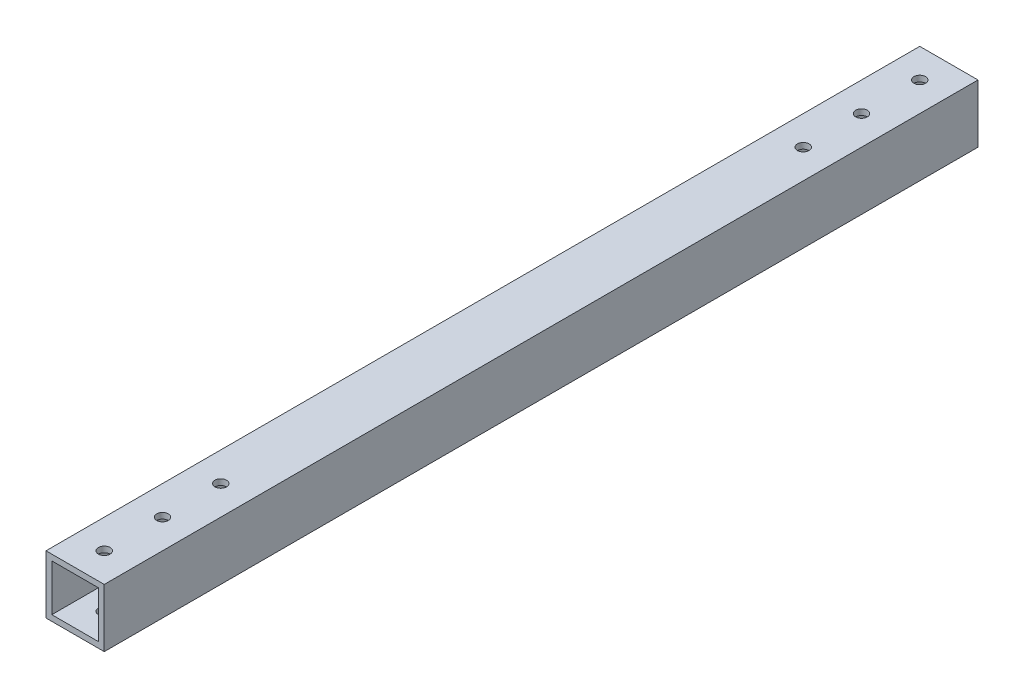
ISO-10303-21;
HEADER;
FILE_DESCRIPTION(('STEP AP214'),'2;1');
FILE_NAME('part.step','',(''),(''),'','','');
FILE_SCHEMA(('AUTOMOTIVE_DESIGN { 1 0 10303 214 1 1 1 1 }'));
ENDSEC;
DATA;
#1=APPLICATION_CONTEXT('core data for automotive mechanical design processes');
#2=APPLICATION_PROTOCOL_DEFINITION('international standard','automotive_design',2000,#1);
#3=PRODUCT_CONTEXT('',#1,'mechanical');
#4=PRODUCT('Part','Part','',(#3));
#5=PRODUCT_RELATED_PRODUCT_CATEGORY('part','',(#4));
#6=PRODUCT_DEFINITION_FORMATION('','',#4);
#7=PRODUCT_DEFINITION_CONTEXT('part definition',#1,'design');
#8=PRODUCT_DEFINITION('design','',#6,#7);
#9=PRODUCT_DEFINITION_SHAPE('','',#8);
#10=(LENGTH_UNIT() NAMED_UNIT(*) SI_UNIT(.MILLI.,.METRE.));
#11=(NAMED_UNIT(*) PLANE_ANGLE_UNIT() SI_UNIT($,.RADIAN.));
#12=(NAMED_UNIT(*) SI_UNIT($,.STERADIAN.) SOLID_ANGLE_UNIT());
#13=UNCERTAINTY_MEASURE_WITH_UNIT(LENGTH_MEASURE(1.E-05),#10,'distance_accuracy_value','');
#14=(GEOMETRIC_REPRESENTATION_CONTEXT(3) GLOBAL_UNCERTAINTY_ASSIGNED_CONTEXT((#13)) GLOBAL_UNIT_ASSIGNED_CONTEXT((#10,
#11,#12)) REPRESENTATION_CONTEXT('',''));
#15=CARTESIAN_POINT('',(0.,0.,0.));
#16=DIRECTION('',(0.,0.,1.));
#17=DIRECTION('',(1.,0.,0.));
#18=AXIS2_PLACEMENT_3D('',#15,#16,#17);
#19=CARTESIAN_POINT('',(0.,0.,300.));
#20=DIRECTION('',(0.,0.,1.));
#21=DIRECTION('',(1.,0.,0.));
#22=AXIS2_PLACEMENT_3D('',#19,#20,#21);
#23=PLANE('',#22);
#24=DIRECTION('',(0.,-1.,0.));
#25=VECTOR('',#24,1.);
#26=CARTESIAN_POINT('',(0.,0.,300.));
#27=LINE('',#26,#25);
#28=CARTESIAN_POINT('',(0.,20.,300.));
#29=VERTEX_POINT('',#28);
#30=CARTESIAN_POINT('',(0.,0.,300.));
#31=VERTEX_POINT('',#30);
#32=EDGE_CURVE('E175',#29,#31,#27,.T.);
#33=ORIENTED_EDGE('',*,*,#32,.T.);
#34=DIRECTION('',(1.,0.,0.));
#35=VECTOR('',#34,1.);
#36=CARTESIAN_POINT('',(0.,0.,300.));
#37=LINE('',#36,#35);
#38=CARTESIAN_POINT('',(20.,0.,300.));
#39=VERTEX_POINT('',#38);
#40=EDGE_CURVE('E178',#31,#39,#37,.T.);
#41=ORIENTED_EDGE('',*,*,#40,.T.);
#42=DIRECTION('',(0.,1.,0.));
#43=VECTOR('',#42,1.);
#44=CARTESIAN_POINT('',(20.,0.,300.));
#45=LINE('',#44,#43);
#46=CARTESIAN_POINT('',(20.,20.,300.));
#47=VERTEX_POINT('',#46);
#48=EDGE_CURVE('E181',#39,#47,#45,.T.);
#49=ORIENTED_EDGE('',*,*,#48,.T.);
#50=DIRECTION('',(-1.,0.,0.));
#51=VECTOR('',#50,1.);
#52=CARTESIAN_POINT('',(0.,20.,300.));
#53=LINE('',#52,#51);
#54=EDGE_CURVE('E183',#47,#29,#53,.T.);
#55=ORIENTED_EDGE('',*,*,#54,.T.);
#56=EDGE_LOOP('',(#33,#41,#49,#55));
#57=FACE_BOUND('',#56,.T.);
#58=DIRECTION('',(1.,0.,0.));
#59=VECTOR('',#58,1.);
#60=CARTESIAN_POINT('',(0.,2.,300.));
#61=LINE('',#60,#59);
#62=CARTESIAN_POINT('',(2.,2.,300.));
#63=VERTEX_POINT('',#62);
#64=CARTESIAN_POINT('',(18.,2.,300.));
#65=VERTEX_POINT('',#64);
#66=EDGE_CURVE('E145',#63,#65,#61,.T.);
#67=ORIENTED_EDGE('',*,*,#66,.F.);
#68=DIRECTION('',(0.,-1.,0.));
#69=VECTOR('',#68,1.);
#70=CARTESIAN_POINT('',(2.,0.,300.));
#71=LINE('',#70,#69);
#72=CARTESIAN_POINT('',(2.,18.,300.));
#73=VERTEX_POINT('',#72);
#74=EDGE_CURVE('E137',#73,#63,#71,.T.);
#75=ORIENTED_EDGE('',*,*,#74,.F.);
#76=DIRECTION('',(-1.,0.,0.));
#77=VECTOR('',#76,1.);
#78=CARTESIAN_POINT('',(0.,18.,300.));
#79=LINE('',#78,#77);
#80=CARTESIAN_POINT('',(18.,18.,300.));
#81=VERTEX_POINT('',#80);
#82=EDGE_CURVE('E159',#81,#73,#79,.T.);
#83=ORIENTED_EDGE('',*,*,#82,.F.);
#84=DIRECTION('',(0.,1.,0.));
#85=VECTOR('',#84,1.);
#86=CARTESIAN_POINT('',(18.,0.,300.));
#87=LINE('',#86,#85);
#88=EDGE_CURVE('E157',#65,#81,#87,.T.);
#89=ORIENTED_EDGE('',*,*,#88,.F.);
#90=EDGE_LOOP('',(#67,#75,#83,#89));
#91=FACE_BOUND('',#90,.T.);
#92=ADVANCED_FACE('F70',(#57,#91),#23,.T.);
#93=CARTESIAN_POINT('',(0.,0.,0.));
#94=DIRECTION('',(0.,0.,1.));
#95=DIRECTION('',(1.,0.,0.));
#96=AXIS2_PLACEMENT_3D('',#93,#94,#95);
#97=PLANE('',#96);
#98=DIRECTION('',(0.,-1.,0.));
#99=VECTOR('',#98,1.);
#100=CARTESIAN_POINT('',(0.,0.,0.));
#101=LINE('',#100,#99);
#102=CARTESIAN_POINT('',(0.,20.,0.));
#103=VERTEX_POINT('',#102);
#104=CARTESIAN_POINT('',(0.,0.,0.));
#105=VERTEX_POINT('',#104);
#106=EDGE_CURVE('E153',#103,#105,#101,.T.);
#107=ORIENTED_EDGE('',*,*,#106,.F.);
#108=DIRECTION('',(-1.,0.,0.));
#109=VECTOR('',#108,1.);
#110=CARTESIAN_POINT('',(0.,20.,0.));
#111=LINE('',#110,#109);
#112=CARTESIAN_POINT('',(20.,20.,0.));
#113=VERTEX_POINT('',#112);
#114=EDGE_CURVE('E179',#113,#103,#111,.T.);
#115=ORIENTED_EDGE('',*,*,#114,.F.);
#116=DIRECTION('',(0.,1.,0.));
#117=VECTOR('',#116,1.);
#118=CARTESIAN_POINT('',(20.,0.,0.));
#119=LINE('',#118,#117);
#120=CARTESIAN_POINT('',(20.,0.,0.));
#121=VERTEX_POINT('',#120);
#122=EDGE_CURVE('E190',#121,#113,#119,.T.);
#123=ORIENTED_EDGE('',*,*,#122,.F.);
#124=DIRECTION('',(1.,0.,0.));
#125=VECTOR('',#124,1.);
#126=CARTESIAN_POINT('',(0.,0.,0.));
#127=LINE('',#126,#125);
#128=EDGE_CURVE('E188',#105,#121,#127,.T.);
#129=ORIENTED_EDGE('',*,*,#128,.F.);
#130=EDGE_LOOP('',(#107,#115,#123,#129));
#131=FACE_BOUND('',#130,.T.);
#132=DIRECTION('',(0.,-1.,0.));
#133=VECTOR('',#132,1.);
#134=CARTESIAN_POINT('',(2.,0.,0.));
#135=LINE('',#134,#133);
#136=CARTESIAN_POINT('',(2.,18.,0.));
#137=VERTEX_POINT('',#136);
#138=CARTESIAN_POINT('',(2.,2.,0.));
#139=VERTEX_POINT('',#138);
#140=EDGE_CURVE('E95',#137,#139,#135,.T.);
#141=ORIENTED_EDGE('',*,*,#140,.T.);
#142=DIRECTION('',(1.,0.,0.));
#143=VECTOR('',#142,1.);
#144=CARTESIAN_POINT('',(0.,2.,0.));
#145=LINE('',#144,#143);
#146=CARTESIAN_POINT('',(18.,2.,0.));
#147=VERTEX_POINT('',#146);
#148=EDGE_CURVE('E152',#139,#147,#145,.T.);
#149=ORIENTED_EDGE('',*,*,#148,.T.);
#150=DIRECTION('',(0.,1.,0.));
#151=VECTOR('',#150,1.);
#152=CARTESIAN_POINT('',(18.,0.,0.));
#153=LINE('',#152,#151);
#154=CARTESIAN_POINT('',(18.,18.,0.));
#155=VERTEX_POINT('',#154);
#156=EDGE_CURVE('E167',#147,#155,#153,.T.);
#157=ORIENTED_EDGE('',*,*,#156,.T.);
#158=DIRECTION('',(-1.,0.,0.));
#159=VECTOR('',#158,1.);
#160=CARTESIAN_POINT('',(0.,18.,0.));
#161=LINE('',#160,#159);
#162=EDGE_CURVE('E146',#155,#137,#161,.T.);
#163=ORIENTED_EDGE('',*,*,#162,.T.);
#164=EDGE_LOOP('',(#141,#149,#157,#163));
#165=FACE_BOUND('',#164,.T.);
#166=ADVANCED_FACE('F254',(#131,#165),#97,.F.);
#167=CARTESIAN_POINT('',(0.,0.,300.));
#168=DIRECTION('',(1.,0.,0.));
#169=DIRECTION('',(0.,0.,-1.));
#170=AXIS2_PLACEMENT_3D('',#167,#168,#169);
#171=PLANE('',#170);
#172=ORIENTED_EDGE('',*,*,#106,.T.);
#173=DIRECTION('',(0.,0.,-1.));
#174=VECTOR('',#173,1.);
#175=CARTESIAN_POINT('',(0.,0.,300.));
#176=LINE('',#175,#174);
#177=EDGE_CURVE('E12',#31,#105,#176,.T.);
#178=ORIENTED_EDGE('',*,*,#177,.F.);
#179=ORIENTED_EDGE('',*,*,#32,.F.);
#180=DIRECTION('',(0.,0.,-1.));
#181=VECTOR('',#180,1.);
#182=CARTESIAN_POINT('',(0.,20.,300.));
#183=LINE('',#182,#181);
#184=EDGE_CURVE('E185',#29,#103,#183,.T.);
#185=ORIENTED_EDGE('',*,*,#184,.T.);
#186=EDGE_LOOP('',(#172,#178,#179,#185));
#187=FACE_BOUND('',#186,.T.);
#188=ADVANCED_FACE('F72',(#187),#171,.F.);
#189=CARTESIAN_POINT('',(0.,0.,300.));
#190=DIRECTION('',(0.,1.,0.));
#191=DIRECTION('',(0.,0.,1.));
#192=AXIS2_PLACEMENT_3D('',#189,#190,#191);
#193=PLANE('',#192);
#194=CARTESIAN_POINT('',(10.,0.,290.));
#195=DIRECTION('',(0.,1.,0.));
#196=DIRECTION('',(0.,0.,1.));
#197=AXIS2_PLACEMENT_3D('',#194,#195,#196);
#198=CIRCLE('',#197,2.);
#199=CARTESIAN_POINT('',(10.,0.,292.));
#200=VERTEX_POINT('',#199);
#201=EDGE_CURVE('E204',#200,#200,#198,.T.);
#202=ORIENTED_EDGE('',*,*,#201,.T.);
#203=EDGE_LOOP('',(#202));
#204=FACE_BOUND('',#203,.T.);
#205=CARTESIAN_POINT('',(10.,0.,50.));
#206=DIRECTION('',(0.,1.,0.));
#207=DIRECTION('',(0.,0.,-1.));
#208=AXIS2_PLACEMENT_3D('',#205,#206,#207);
#209=CIRCLE('',#208,2.);
#210=CARTESIAN_POINT('',(10.,0.,48.));
#211=VERTEX_POINT('',#210);
#212=EDGE_CURVE('E296',#211,#211,#209,.T.);
#213=ORIENTED_EDGE('',*,*,#212,.T.);
#214=EDGE_LOOP('',(#213));
#215=FACE_BOUND('',#214,.T.);
#216=CARTESIAN_POINT('',(10.,0.,30.));
#217=DIRECTION('',(0.,1.,0.));
#218=DIRECTION('',(0.,0.,-1.));
#219=AXIS2_PLACEMENT_3D('',#216,#217,#218);
#220=CIRCLE('',#219,2.);
#221=CARTESIAN_POINT('',(10.,0.,28.));
#222=VERTEX_POINT('',#221);
#223=EDGE_CURVE('E300',#222,#222,#220,.T.);
#224=ORIENTED_EDGE('',*,*,#223,.T.);
#225=EDGE_LOOP('',(#224));
#226=FACE_BOUND('',#225,.T.);
#227=CARTESIAN_POINT('',(10.,0.,10.));
#228=DIRECTION('',(0.,1.,0.));
#229=DIRECTION('',(0.,0.,-1.));
#230=AXIS2_PLACEMENT_3D('',#227,#228,#229);
#231=CIRCLE('',#230,2.);
#232=CARTESIAN_POINT('',(10.,0.,8.00000000000001));
#233=VERTEX_POINT('',#232);
#234=EDGE_CURVE('E304',#233,#233,#231,.T.);
#235=ORIENTED_EDGE('',*,*,#234,.T.);
#236=EDGE_LOOP('',(#235));
#237=FACE_BOUND('',#236,.T.);
#238=CARTESIAN_POINT('',(10.,0.,250.));
#239=DIRECTION('',(0.,1.,0.));
#240=DIRECTION('',(0.,0.,1.));
#241=AXIS2_PLACEMENT_3D('',#238,#239,#240);
#242=CIRCLE('',#241,2.);
#243=CARTESIAN_POINT('',(10.,0.,252.));
#244=VERTEX_POINT('',#243);
#245=EDGE_CURVE('E308',#244,#244,#242,.T.);
#246=ORIENTED_EDGE('',*,*,#245,.T.);
#247=EDGE_LOOP('',(#246));
#248=FACE_BOUND('',#247,.T.);
#249=CARTESIAN_POINT('',(10.,0.,270.));
#250=DIRECTION('',(0.,1.,0.));
#251=DIRECTION('',(0.,0.,1.));
#252=AXIS2_PLACEMENT_3D('',#249,#250,#251);
#253=CIRCLE('',#252,2.);
#254=CARTESIAN_POINT('',(10.,0.,272.));
#255=VERTEX_POINT('',#254);
#256=EDGE_CURVE('E312',#255,#255,#253,.T.);
#257=ORIENTED_EDGE('',*,*,#256,.T.);
#258=EDGE_LOOP('',(#257));
#259=FACE_BOUND('',#258,.T.);
#260=ORIENTED_EDGE('',*,*,#128,.T.);
#261=DIRECTION('',(0.,0.,-1.));
#262=VECTOR('',#261,1.);
#263=CARTESIAN_POINT('',(20.,0.,300.));
#264=LINE('',#263,#262);
#265=EDGE_CURVE('E79',#39,#121,#264,.T.);
#266=ORIENTED_EDGE('',*,*,#265,.F.);
#267=ORIENTED_EDGE('',*,*,#40,.F.);
#268=ORIENTED_EDGE('',*,*,#177,.T.);
#269=EDGE_LOOP('',(#260,#266,#267,#268));
#270=FACE_BOUND('',#269,.T.);
#271=ADVANCED_FACE('F282',(#204,#215,#226,#237,#248,#259,#270),#193,.F.);
#272=CARTESIAN_POINT('',(20.,0.,300.));
#273=DIRECTION('',(-1.,0.,0.));
#274=DIRECTION('',(0.,0.,1.));
#275=AXIS2_PLACEMENT_3D('',#272,#273,#274);
#276=PLANE('',#275);
#277=ORIENTED_EDGE('',*,*,#122,.T.);
#278=DIRECTION('',(0.,0.,-1.));
#279=VECTOR('',#278,1.);
#280=CARTESIAN_POINT('',(20.,20.,300.));
#281=LINE('',#280,#279);
#282=EDGE_CURVE('E195',#47,#113,#281,.T.);
#283=ORIENTED_EDGE('',*,*,#282,.F.);
#284=ORIENTED_EDGE('',*,*,#48,.F.);
#285=ORIENTED_EDGE('',*,*,#265,.T.);
#286=EDGE_LOOP('',(#277,#283,#284,#285));
#287=FACE_BOUND('',#286,.T.);
#288=ADVANCED_FACE('F279',(#287),#276,.F.);
#289=CARTESIAN_POINT('',(0.,20.,300.));
#290=DIRECTION('',(0.,-1.,0.));
#291=DIRECTION('',(0.,0.,-1.));
#292=AXIS2_PLACEMENT_3D('',#289,#290,#291);
#293=PLANE('',#292);
#294=CARTESIAN_POINT('',(10.,20.,290.));
#295=DIRECTION('',(0.,1.,0.));
#296=DIRECTION('',(0.,0.,1.));
#297=AXIS2_PLACEMENT_3D('',#294,#295,#296);
#298=CIRCLE('',#297,2.);
#299=CARTESIAN_POINT('',(10.,20.,292.));
#300=VERTEX_POINT('',#299);
#301=EDGE_CURVE('E329',#300,#300,#298,.T.);
#302=ORIENTED_EDGE('',*,*,#301,.F.);
#303=EDGE_LOOP('',(#302));
#304=FACE_BOUND('',#303,.T.);
#305=CARTESIAN_POINT('',(10.,20.,50.));
#306=DIRECTION('',(0.,1.,0.));
#307=DIRECTION('',(0.,0.,-1.));
#308=AXIS2_PLACEMENT_3D('',#305,#306,#307);
#309=CIRCLE('',#308,2.);
#310=CARTESIAN_POINT('',(10.,20.,48.));
#311=VERTEX_POINT('',#310);
#312=EDGE_CURVE('E344',#311,#311,#309,.T.);
#313=ORIENTED_EDGE('',*,*,#312,.F.);
#314=EDGE_LOOP('',(#313));
#315=FACE_BOUND('',#314,.T.);
#316=CARTESIAN_POINT('',(10.,20.,30.));
#317=DIRECTION('',(0.,1.,0.));
#318=DIRECTION('',(0.,0.,-1.));
#319=AXIS2_PLACEMENT_3D('',#316,#317,#318);
#320=CIRCLE('',#319,2.);
#321=CARTESIAN_POINT('',(10.,20.,28.));
#322=VERTEX_POINT('',#321);
#323=EDGE_CURVE('E340',#322,#322,#320,.T.);
#324=ORIENTED_EDGE('',*,*,#323,.F.);
#325=EDGE_LOOP('',(#324));
#326=FACE_BOUND('',#325,.T.);
#327=CARTESIAN_POINT('',(10.,20.,10.));
#328=DIRECTION('',(0.,1.,0.));
#329=DIRECTION('',(0.,0.,-1.));
#330=AXIS2_PLACEMENT_3D('',#327,#328,#329);
#331=CIRCLE('',#330,2.);
#332=CARTESIAN_POINT('',(10.,20.,8.00000000000001));
#333=VERTEX_POINT('',#332);
#334=EDGE_CURVE('E336',#333,#333,#331,.T.);
#335=ORIENTED_EDGE('',*,*,#334,.F.);
#336=EDGE_LOOP('',(#335));
#337=FACE_BOUND('',#336,.T.);
#338=CARTESIAN_POINT('',(10.,20.,250.));
#339=DIRECTION('',(0.,1.,0.));
#340=DIRECTION('',(0.,0.,1.));
#341=AXIS2_PLACEMENT_3D('',#338,#339,#340);
#342=CIRCLE('',#341,2.);
#343=CARTESIAN_POINT('',(10.,20.,252.));
#344=VERTEX_POINT('',#343);
#345=EDGE_CURVE('E326',#344,#344,#342,.T.);
#346=ORIENTED_EDGE('',*,*,#345,.F.);
#347=EDGE_LOOP('',(#346));
#348=FACE_BOUND('',#347,.T.);
#349=CARTESIAN_POINT('',(10.,20.,270.));
#350=DIRECTION('',(0.,1.,0.));
#351=DIRECTION('',(0.,0.,1.));
#352=AXIS2_PLACEMENT_3D('',#349,#350,#351);
#353=CIRCLE('',#352,2.);
#354=CARTESIAN_POINT('',(10.,20.,272.));
#355=VERTEX_POINT('',#354);
#356=EDGE_CURVE('E325',#355,#355,#353,.T.);
#357=ORIENTED_EDGE('',*,*,#356,.F.);
#358=EDGE_LOOP('',(#357));
#359=FACE_BOUND('',#358,.T.);
#360=ORIENTED_EDGE('',*,*,#114,.T.);
#361=ORIENTED_EDGE('',*,*,#184,.F.);
#362=ORIENTED_EDGE('',*,*,#54,.F.);
#363=ORIENTED_EDGE('',*,*,#282,.T.);
#364=EDGE_LOOP('',(#360,#361,#362,#363));
#365=FACE_BOUND('',#364,.T.);
#366=ADVANCED_FACE('F276',(#304,#315,#326,#337,#348,#359,#365),#293,.F.);
#367=CARTESIAN_POINT('',(2.,0.,300.));
#368=DIRECTION('',(1.,0.,0.));
#369=DIRECTION('',(0.,0.,-1.));
#370=AXIS2_PLACEMENT_3D('',#367,#368,#369);
#371=PLANE('',#370);
#372=ORIENTED_EDGE('',*,*,#140,.F.);
#373=DIRECTION('',(0.,0.,-1.));
#374=VECTOR('',#373,1.);
#375=CARTESIAN_POINT('',(2.,18.,300.));
#376=LINE('',#375,#374);
#377=EDGE_CURVE('E141',#73,#137,#376,.T.);
#378=ORIENTED_EDGE('',*,*,#377,.F.);
#379=ORIENTED_EDGE('',*,*,#74,.T.);
#380=DIRECTION('',(0.,0.,-1.));
#381=VECTOR('',#380,1.);
#382=CARTESIAN_POINT('',(2.,2.,300.));
#383=LINE('',#382,#381);
#384=EDGE_CURVE('E140',#63,#139,#383,.T.);
#385=ORIENTED_EDGE('',*,*,#384,.T.);
#386=EDGE_LOOP('',(#372,#378,#379,#385));
#387=FACE_BOUND('',#386,.T.);
#388=ADVANCED_FACE('F139',(#387),#371,.T.);
#389=CARTESIAN_POINT('',(0.,2.,300.));
#390=DIRECTION('',(0.,1.,0.));
#391=DIRECTION('',(0.,0.,1.));
#392=AXIS2_PLACEMENT_3D('',#389,#390,#391);
#393=PLANE('',#392);
#394=CARTESIAN_POINT('',(10.,2.,290.));
#395=DIRECTION('',(0.,1.,0.));
#396=DIRECTION('',(0.,0.,1.));
#397=AXIS2_PLACEMENT_3D('',#394,#395,#396);
#398=CIRCLE('',#397,2.);
#399=CARTESIAN_POINT('',(10.,2.,292.));
#400=VERTEX_POINT('',#399);
#401=EDGE_CURVE('E165',#400,#400,#398,.T.);
#402=ORIENTED_EDGE('',*,*,#401,.F.);
#403=EDGE_LOOP('',(#402));
#404=FACE_BOUND('',#403,.T.);
#405=CARTESIAN_POINT('',(10.,2.,50.));
#406=DIRECTION('',(0.,1.,0.));
#407=DIRECTION('',(0.,0.,1.));
#408=AXIS2_PLACEMENT_3D('',#405,#406,#407);
#409=CIRCLE('',#408,2.);
#410=CARTESIAN_POINT('',(10.,2.,52.));
#411=VERTEX_POINT('',#410);
#412=EDGE_CURVE('E218',#411,#411,#409,.T.);
#413=ORIENTED_EDGE('',*,*,#412,.F.);
#414=EDGE_LOOP('',(#413));
#415=FACE_BOUND('',#414,.T.);
#416=CARTESIAN_POINT('',(10.,2.,30.));
#417=DIRECTION('',(0.,1.,0.));
#418=DIRECTION('',(0.,0.,1.));
#419=AXIS2_PLACEMENT_3D('',#416,#417,#418);
#420=CIRCLE('',#419,2.);
#421=CARTESIAN_POINT('',(10.,2.,32.));
#422=VERTEX_POINT('',#421);
#423=EDGE_CURVE('E215',#422,#422,#420,.T.);
#424=ORIENTED_EDGE('',*,*,#423,.F.);
#425=EDGE_LOOP('',(#424));
#426=FACE_BOUND('',#425,.T.);
#427=CARTESIAN_POINT('',(10.,2.,10.));
#428=DIRECTION('',(0.,1.,0.));
#429=DIRECTION('',(0.,0.,1.));
#430=AXIS2_PLACEMENT_3D('',#427,#428,#429);
#431=CIRCLE('',#430,2.);
#432=CARTESIAN_POINT('',(10.,2.,12.));
#433=VERTEX_POINT('',#432);
#434=EDGE_CURVE('E212',#433,#433,#431,.T.);
#435=ORIENTED_EDGE('',*,*,#434,.F.);
#436=EDGE_LOOP('',(#435));
#437=FACE_BOUND('',#436,.T.);
#438=CARTESIAN_POINT('',(10.,2.,250.));
#439=DIRECTION('',(0.,1.,0.));
#440=DIRECTION('',(0.,0.,1.));
#441=AXIS2_PLACEMENT_3D('',#438,#439,#440);
#442=CIRCLE('',#441,2.);
#443=CARTESIAN_POINT('',(10.,2.,252.));
#444=VERTEX_POINT('',#443);
#445=EDGE_CURVE('E208',#444,#444,#442,.T.);
#446=ORIENTED_EDGE('',*,*,#445,.F.);
#447=EDGE_LOOP('',(#446));
#448=FACE_BOUND('',#447,.T.);
#449=CARTESIAN_POINT('',(10.,2.,270.));
#450=DIRECTION('',(0.,1.,0.));
#451=DIRECTION('',(0.,0.,1.));
#452=AXIS2_PLACEMENT_3D('',#449,#450,#451);
#453=CIRCLE('',#452,2.);
#454=CARTESIAN_POINT('',(10.,2.,272.));
#455=VERTEX_POINT('',#454);
#456=EDGE_CURVE('E203',#455,#455,#453,.T.);
#457=ORIENTED_EDGE('',*,*,#456,.F.);
#458=EDGE_LOOP('',(#457));
#459=FACE_BOUND('',#458,.T.);
#460=ORIENTED_EDGE('',*,*,#148,.F.);
#461=ORIENTED_EDGE('',*,*,#384,.F.);
#462=ORIENTED_EDGE('',*,*,#66,.T.);
#463=DIRECTION('',(0.,0.,-1.));
#464=VECTOR('',#463,1.);
#465=CARTESIAN_POINT('',(18.,2.,300.));
#466=LINE('',#465,#464);
#467=EDGE_CURVE('E154',#65,#147,#466,.T.);
#468=ORIENTED_EDGE('',*,*,#467,.T.);
#469=EDGE_LOOP('',(#460,#461,#462,#468));
#470=FACE_BOUND('',#469,.T.);
#471=ADVANCED_FACE('F149',(#404,#415,#426,#437,#448,#459,#470),#393,.T.);
#472=CARTESIAN_POINT('',(18.,0.,300.));
#473=DIRECTION('',(-1.,0.,0.));
#474=DIRECTION('',(0.,0.,1.));
#475=AXIS2_PLACEMENT_3D('',#472,#473,#474);
#476=PLANE('',#475);
#477=ORIENTED_EDGE('',*,*,#156,.F.);
#478=ORIENTED_EDGE('',*,*,#467,.F.);
#479=ORIENTED_EDGE('',*,*,#88,.T.);
#480=DIRECTION('',(0.,0.,-1.));
#481=VECTOR('',#480,1.);
#482=CARTESIAN_POINT('',(18.,18.,300.));
#483=LINE('',#482,#481);
#484=EDGE_CURVE('E87',#81,#155,#483,.T.);
#485=ORIENTED_EDGE('',*,*,#484,.T.);
#486=EDGE_LOOP('',(#477,#478,#479,#485));
#487=FACE_BOUND('',#486,.T.);
#488=ADVANCED_FACE('F242',(#487),#476,.T.);
#489=CARTESIAN_POINT('',(0.,18.,300.));
#490=DIRECTION('',(0.,-1.,0.));
#491=DIRECTION('',(0.,0.,-1.));
#492=AXIS2_PLACEMENT_3D('',#489,#490,#491);
#493=PLANE('',#492);
#494=CARTESIAN_POINT('',(10.,18.,290.));
#495=DIRECTION('',(0.,-1.,0.));
#496=DIRECTION('',(0.,0.,-1.));
#497=AXIS2_PLACEMENT_3D('',#494,#495,#496);
#498=CIRCLE('',#497,2.);
#499=CARTESIAN_POINT('',(10.,18.,288.));
#500=VERTEX_POINT('',#499);
#501=EDGE_CURVE('E74',#500,#500,#498,.T.);
#502=ORIENTED_EDGE('',*,*,#501,.F.);
#503=EDGE_LOOP('',(#502));
#504=FACE_BOUND('',#503,.T.);
#505=CARTESIAN_POINT('',(10.,18.,50.));
#506=DIRECTION('',(0.,-1.,0.));
#507=DIRECTION('',(0.,0.,-1.));
#508=AXIS2_PLACEMENT_3D('',#505,#506,#507);
#509=CIRCLE('',#508,2.);
#510=CARTESIAN_POINT('',(10.,18.,48.));
#511=VERTEX_POINT('',#510);
#512=EDGE_CURVE('E216',#511,#511,#509,.T.);
#513=ORIENTED_EDGE('',*,*,#512,.F.);
#514=EDGE_LOOP('',(#513));
#515=FACE_BOUND('',#514,.T.);
#516=CARTESIAN_POINT('',(10.,18.,30.));
#517=DIRECTION('',(0.,-1.,0.));
#518=DIRECTION('',(0.,0.,-1.));
#519=AXIS2_PLACEMENT_3D('',#516,#517,#518);
#520=CIRCLE('',#519,2.);
#521=CARTESIAN_POINT('',(10.,18.,28.));
#522=VERTEX_POINT('',#521);
#523=EDGE_CURVE('E213',#522,#522,#520,.T.);
#524=ORIENTED_EDGE('',*,*,#523,.F.);
#525=EDGE_LOOP('',(#524));
#526=FACE_BOUND('',#525,.T.);
#527=CARTESIAN_POINT('',(10.,18.,10.));
#528=DIRECTION('',(0.,-1.,0.));
#529=DIRECTION('',(0.,0.,-1.));
#530=AXIS2_PLACEMENT_3D('',#527,#528,#529);
#531=CIRCLE('',#530,2.);
#532=CARTESIAN_POINT('',(10.,18.,8.00000000000001));
#533=VERTEX_POINT('',#532);
#534=EDGE_CURVE('E209',#533,#533,#531,.T.);
#535=ORIENTED_EDGE('',*,*,#534,.F.);
#536=EDGE_LOOP('',(#535));
#537=FACE_BOUND('',#536,.T.);
#538=CARTESIAN_POINT('',(10.,18.,250.));
#539=DIRECTION('',(0.,-1.,0.));
#540=DIRECTION('',(0.,0.,-1.));
#541=AXIS2_PLACEMENT_3D('',#538,#539,#540);
#542=CIRCLE('',#541,2.);
#543=CARTESIAN_POINT('',(10.,18.,248.));
#544=VERTEX_POINT('',#543);
#545=EDGE_CURVE('E205',#544,#544,#542,.T.);
#546=ORIENTED_EDGE('',*,*,#545,.F.);
#547=EDGE_LOOP('',(#546));
#548=FACE_BOUND('',#547,.T.);
#549=CARTESIAN_POINT('',(10.,18.,270.));
#550=DIRECTION('',(0.,-1.,0.));
#551=DIRECTION('',(0.,0.,-1.));
#552=AXIS2_PLACEMENT_3D('',#549,#550,#551);
#553=CIRCLE('',#552,2.);
#554=CARTESIAN_POINT('',(10.,18.,268.));
#555=VERTEX_POINT('',#554);
#556=EDGE_CURVE('E200',#555,#555,#553,.T.);
#557=ORIENTED_EDGE('',*,*,#556,.F.);
#558=EDGE_LOOP('',(#557));
#559=FACE_BOUND('',#558,.T.);
#560=ORIENTED_EDGE('',*,*,#162,.F.);
#561=ORIENTED_EDGE('',*,*,#484,.F.);
#562=ORIENTED_EDGE('',*,*,#82,.T.);
#563=ORIENTED_EDGE('',*,*,#377,.T.);
#564=EDGE_LOOP('',(#560,#561,#562,#563));
#565=FACE_BOUND('',#564,.T.);
#566=ADVANCED_FACE('F238',(#504,#515,#526,#537,#548,#559,#565),#493,.T.);
#567=CARTESIAN_POINT('',(10.,0.,270.));
#568=DIRECTION('',(0.,1.,0.));
#569=DIRECTION('',(0.,0.,1.));
#570=AXIS2_PLACEMENT_3D('',#567,#568,#569);
#571=CYLINDRICAL_SURFACE('',#570,2.);
#572=ORIENTED_EDGE('',*,*,#556,.T.);
#573=EDGE_LOOP('',(#572));
#574=FACE_BOUND('',#573,.T.);
#575=ORIENTED_EDGE('',*,*,#356,.T.);
#576=EDGE_LOOP('',(#575));
#577=FACE_BOUND('',#576,.T.);
#578=ADVANCED_FACE('F241',(#574,#577),#571,.F.);
#579=CARTESIAN_POINT('',(10.,0.,250.));
#580=DIRECTION('',(0.,1.,0.));
#581=DIRECTION('',(0.,0.,1.));
#582=AXIS2_PLACEMENT_3D('',#579,#580,#581);
#583=CYLINDRICAL_SURFACE('',#582,2.);
#584=ORIENTED_EDGE('',*,*,#545,.T.);
#585=EDGE_LOOP('',(#584));
#586=FACE_BOUND('',#585,.T.);
#587=ORIENTED_EDGE('',*,*,#345,.T.);
#588=EDGE_LOOP('',(#587));
#589=FACE_BOUND('',#588,.T.);
#590=ADVANCED_FACE('F364',(#586,#589),#583,.F.);
#591=CARTESIAN_POINT('',(10.,0.,10.));
#592=DIRECTION('',(0.,1.,0.));
#593=DIRECTION('',(0.,0.,1.));
#594=AXIS2_PLACEMENT_3D('',#591,#592,#593);
#595=CYLINDRICAL_SURFACE('',#594,2.);
#596=ORIENTED_EDGE('',*,*,#534,.T.);
#597=EDGE_LOOP('',(#596));
#598=FACE_BOUND('',#597,.T.);
#599=ORIENTED_EDGE('',*,*,#334,.T.);
#600=EDGE_LOOP('',(#599));
#601=FACE_BOUND('',#600,.T.);
#602=ADVANCED_FACE('F374',(#598,#601),#595,.F.);
#603=CARTESIAN_POINT('',(10.,0.,30.));
#604=DIRECTION('',(0.,1.,0.));
#605=DIRECTION('',(0.,0.,1.));
#606=AXIS2_PLACEMENT_3D('',#603,#604,#605);
#607=CYLINDRICAL_SURFACE('',#606,2.);
#608=ORIENTED_EDGE('',*,*,#523,.T.);
#609=EDGE_LOOP('',(#608));
#610=FACE_BOUND('',#609,.T.);
#611=ORIENTED_EDGE('',*,*,#323,.T.);
#612=EDGE_LOOP('',(#611));
#613=FACE_BOUND('',#612,.T.);
#614=ADVANCED_FACE('F382',(#610,#613),#607,.F.);
#615=CARTESIAN_POINT('',(10.,0.,50.));
#616=DIRECTION('',(0.,1.,0.));
#617=DIRECTION('',(0.,0.,1.));
#618=AXIS2_PLACEMENT_3D('',#615,#616,#617);
#619=CYLINDRICAL_SURFACE('',#618,2.);
#620=ORIENTED_EDGE('',*,*,#512,.T.);
#621=EDGE_LOOP('',(#620));
#622=FACE_BOUND('',#621,.T.);
#623=ORIENTED_EDGE('',*,*,#312,.T.);
#624=EDGE_LOOP('',(#623));
#625=FACE_BOUND('',#624,.T.);
#626=ADVANCED_FACE('F365',(#622,#625),#619,.F.);
#627=CARTESIAN_POINT('',(10.,0.,290.));
#628=DIRECTION('',(0.,1.,0.));
#629=DIRECTION('',(0.,0.,1.));
#630=AXIS2_PLACEMENT_3D('',#627,#628,#629);
#631=CYLINDRICAL_SURFACE('',#630,2.);
#632=ORIENTED_EDGE('',*,*,#501,.T.);
#633=EDGE_LOOP('',(#632));
#634=FACE_BOUND('',#633,.T.);
#635=ORIENTED_EDGE('',*,*,#301,.T.);
#636=EDGE_LOOP('',(#635));
#637=FACE_BOUND('',#636,.T.);
#638=ADVANCED_FACE('F235',(#634,#637),#631,.F.);
#639=ORIENTED_EDGE('',*,*,#456,.T.);
#640=EDGE_LOOP('',(#639));
#641=FACE_BOUND('',#640,.T.);
#642=ORIENTED_EDGE('',*,*,#256,.F.);
#643=EDGE_LOOP('',(#642));
#644=FACE_BOUND('',#643,.T.);
#645=ADVANCED_FACE('F355',(#641,#644),#571,.F.);
#646=ORIENTED_EDGE('',*,*,#445,.T.);
#647=EDGE_LOOP('',(#646));
#648=FACE_BOUND('',#647,.T.);
#649=ORIENTED_EDGE('',*,*,#245,.F.);
#650=EDGE_LOOP('',(#649));
#651=FACE_BOUND('',#650,.T.);
#652=ADVANCED_FACE('F349',(#648,#651),#583,.F.);
#653=ORIENTED_EDGE('',*,*,#434,.T.);
#654=EDGE_LOOP('',(#653));
#655=FACE_BOUND('',#654,.T.);
#656=ORIENTED_EDGE('',*,*,#234,.F.);
#657=EDGE_LOOP('',(#656));
#658=FACE_BOUND('',#657,.T.);
#659=ADVANCED_FACE('F362',(#655,#658),#595,.F.);
#660=ORIENTED_EDGE('',*,*,#423,.T.);
#661=EDGE_LOOP('',(#660));
#662=FACE_BOUND('',#661,.T.);
#663=ORIENTED_EDGE('',*,*,#223,.F.);
#664=EDGE_LOOP('',(#663));
#665=FACE_BOUND('',#664,.T.);
#666=ADVANCED_FACE('F389',(#662,#665),#607,.F.);
#667=ORIENTED_EDGE('',*,*,#412,.T.);
#668=EDGE_LOOP('',(#667));
#669=FACE_BOUND('',#668,.T.);
#670=ORIENTED_EDGE('',*,*,#212,.F.);
#671=EDGE_LOOP('',(#670));
#672=FACE_BOUND('',#671,.T.);
#673=ADVANCED_FACE('F393',(#669,#672),#619,.F.);
#674=ORIENTED_EDGE('',*,*,#401,.T.);
#675=EDGE_LOOP('',(#674));
#676=FACE_BOUND('',#675,.T.);
#677=ORIENTED_EDGE('',*,*,#201,.F.);
#678=EDGE_LOOP('',(#677));
#679=FACE_BOUND('',#678,.T.);
#680=ADVANCED_FACE('F367',(#676,#679),#631,.F.);
#681=CLOSED_SHELL('',(#92,#166,#188,#271,#288,#366,#388,#471,#488,#566,#578,#590,#602,#614,#626,
#638,#645,#652,#659,#666,#673,#680));
#682=MANIFOLD_SOLID_BREP('B2',#681);
#683=ADVANCED_BREP_SHAPE_REPRESENTATION('',(#18,#682),#14);
#684=SHAPE_DEFINITION_REPRESENTATION(#9,#683);
ENDSEC;
END-ISO-10303-21;
